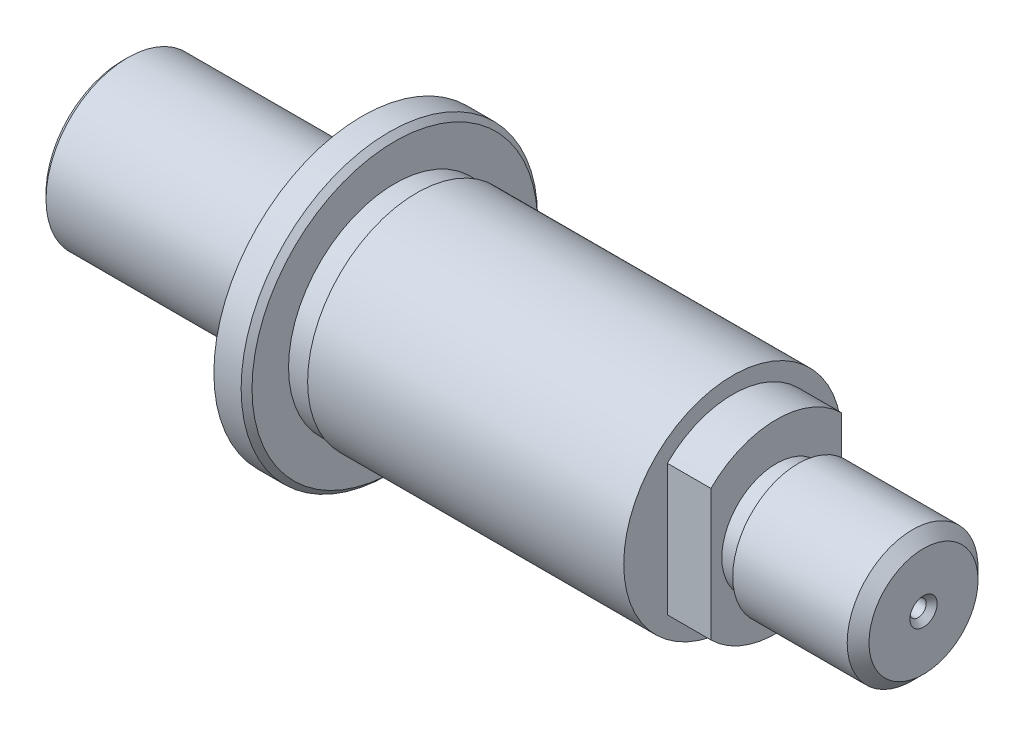
ISO-10303-21;
HEADER;
FILE_DESCRIPTION(('STEP AP214'),'2;1');
FILE_NAME('part.step','',(''),(''),'','','');
FILE_SCHEMA(('AUTOMOTIVE_DESIGN { 1 0 10303 214 1 1 1 1 }'));
ENDSEC;
DATA;
#1=APPLICATION_CONTEXT('core data for automotive mechanical design processes');
#2=APPLICATION_PROTOCOL_DEFINITION('international standard','automotive_design',2000,#1);
#3=PRODUCT_CONTEXT('',#1,'mechanical');
#4=PRODUCT('Part','Part','',(#3));
#5=PRODUCT_RELATED_PRODUCT_CATEGORY('part','',(#4));
#6=PRODUCT_DEFINITION_FORMATION('','',#4);
#7=PRODUCT_DEFINITION_CONTEXT('part definition',#1,'design');
#8=PRODUCT_DEFINITION('design','',#6,#7);
#9=PRODUCT_DEFINITION_SHAPE('','',#8);
#10=(LENGTH_UNIT() NAMED_UNIT(*) SI_UNIT(.MILLI.,.METRE.));
#11=(NAMED_UNIT(*) PLANE_ANGLE_UNIT() SI_UNIT($,.RADIAN.));
#12=(NAMED_UNIT(*) SI_UNIT($,.STERADIAN.) SOLID_ANGLE_UNIT());
#13=UNCERTAINTY_MEASURE_WITH_UNIT(LENGTH_MEASURE(1.E-05),#10,'distance_accuracy_value','');
#14=(GEOMETRIC_REPRESENTATION_CONTEXT(3) GLOBAL_UNCERTAINTY_ASSIGNED_CONTEXT((#13)) GLOBAL_UNIT_ASSIGNED_CONTEXT((#10,
#11,#12)) REPRESENTATION_CONTEXT('',''));
#15=CARTESIAN_POINT('',(0.,0.,0.));
#16=DIRECTION('',(0.,0.,1.));
#17=DIRECTION('',(1.,0.,0.));
#18=AXIS2_PLACEMENT_3D('',#15,#16,#17);
#19=CARTESIAN_POINT('',(0.,0.,0.));
#20=DIRECTION('',(-1.,0.,0.));
#21=DIRECTION('',(0.,0.,1.));
#22=AXIS2_PLACEMENT_3D('',#19,#20,#21);
#23=CYLINDRICAL_SURFACE('',#22,8.5);
#24=CARTESIAN_POINT('',(60.,0.,0.));
#25=DIRECTION('',(-1.,0.,0.));
#26=DIRECTION('',(0.,0.,1.));
#27=AXIS2_PLACEMENT_3D('',#24,#25,#26);
#28=CIRCLE('',#27,8.5);
#29=CARTESIAN_POINT('',(60.,6.02079728939615,6.));
#30=VERTEX_POINT('',#29);
#31=CARTESIAN_POINT('',(60.,6.02079728939615,-6.));
#32=VERTEX_POINT('',#31);
#33=EDGE_CURVE('E143',#30,#32,#28,.T.);
#34=ORIENTED_EDGE('',*,*,#33,.T.);
#35=DIRECTION('',(-1.,0.,0.));
#36=VECTOR('',#35,1.);
#37=CARTESIAN_POINT('',(0.,6.02079728939615,-6.));
#38=LINE('',#37,#36);
#39=CARTESIAN_POINT('',(56.,6.02079728939615,-6.));
#40=VERTEX_POINT('',#39);
#41=EDGE_CURVE('E108',#32,#40,#38,.T.);
#42=ORIENTED_EDGE('',*,*,#41,.T.);
#43=CARTESIAN_POINT('',(56.,0.,0.));
#44=DIRECTION('',(-1.,0.,0.));
#45=DIRECTION('',(0.,0.,1.));
#46=AXIS2_PLACEMENT_3D('',#43,#44,#45);
#47=CIRCLE('',#46,8.5);
#48=CARTESIAN_POINT('',(56.,6.02079728939615,6.));
#49=VERTEX_POINT('',#48);
#50=EDGE_CURVE('E139',#49,#40,#47,.T.);
#51=ORIENTED_EDGE('',*,*,#50,.F.);
#52=DIRECTION('',(-1.,0.,0.));
#53=VECTOR('',#52,1.);
#54=CARTESIAN_POINT('',(0.,6.02079728939615,6.));
#55=LINE('',#54,#53);
#56=EDGE_CURVE('E115',#49,#30,#55,.F.);
#57=ORIENTED_EDGE('',*,*,#56,.T.);
#58=EDGE_LOOP('',(#34,#42,#51,#57));
#59=FACE_BOUND('',#58,.T.);
#60=ADVANCED_FACE('F41',(#59),#23,.T.);
#61=CARTESIAN_POINT('',(73.5,6.,0.));
#62=DIRECTION('',(-1.,0.,0.));
#63=DIRECTION('',(0.,0.,1.));
#64=AXIS2_PLACEMENT_3D('',#61,#62,#63);
#65=PLANE('',#64);
#66=CARTESIAN_POINT('',(73.5,0.,0.));
#67=DIRECTION('',(-1.,0.,0.));
#68=DIRECTION('',(0.,0.,1.));
#69=AXIS2_PLACEMENT_3D('',#66,#67,#68);
#70=CIRCLE('',#69,1.25000000000002);
#71=CARTESIAN_POINT('',(73.5,0.,1.25000000000002));
#72=VERTEX_POINT('',#71);
#73=EDGE_CURVE('E170',#72,#72,#70,.T.);
#74=ORIENTED_EDGE('',*,*,#73,.T.);
#75=EDGE_LOOP('',(#74));
#76=FACE_BOUND('',#75,.T.);
#77=CARTESIAN_POINT('',(73.5,0.,0.));
#78=DIRECTION('',(-1.,0.,0.));
#79=DIRECTION('',(0.,0.,1.));
#80=AXIS2_PLACEMENT_3D('',#77,#78,#79);
#81=CIRCLE('',#80,5.);
#82=CARTESIAN_POINT('',(73.5,0.,5.));
#83=VERTEX_POINT('',#82);
#84=EDGE_CURVE('E164',#83,#83,#81,.F.);
#85=ORIENTED_EDGE('',*,*,#84,.T.);
#86=EDGE_LOOP('',(#85));
#87=FACE_BOUND('',#86,.T.);
#88=ADVANCED_FACE('F193',(#76,#87),#65,.F.);
#89=CARTESIAN_POINT('',(0.,0.,0.));
#90=DIRECTION('',(-1.,0.,0.));
#91=DIRECTION('',(0.,0.,1.));
#92=AXIS2_PLACEMENT_3D('',#89,#90,#91);
#93=CYLINDRICAL_SURFACE('',#92,6.);
#94=CARTESIAN_POINT('',(72.5,0.,0.));
#95=DIRECTION('',(-1.,0.,0.));
#96=DIRECTION('',(0.,0.,1.));
#97=AXIS2_PLACEMENT_3D('',#94,#95,#96);
#98=CIRCLE('',#97,6.);
#99=CARTESIAN_POINT('',(72.5,0.,6.));
#100=VERTEX_POINT('',#99);
#101=EDGE_CURVE('E161',#100,#100,#98,.T.);
#102=ORIENTED_EDGE('',*,*,#101,.T.);
#103=EDGE_LOOP('',(#102));
#104=FACE_BOUND('',#103,.T.);
#105=CARTESIAN_POINT('',(62.,0.,0.));
#106=DIRECTION('',(-1.,0.,0.));
#107=DIRECTION('',(0.,0.,1.));
#108=AXIS2_PLACEMENT_3D('',#105,#106,#107);
#109=CIRCLE('',#108,6.);
#110=CARTESIAN_POINT('',(62.,0.,6.));
#111=VERTEX_POINT('',#110);
#112=EDGE_CURVE('E152',#111,#111,#109,.T.);
#113=ORIENTED_EDGE('',*,*,#112,.F.);
#114=EDGE_LOOP('',(#113));
#115=FACE_BOUND('',#114,.T.);
#116=ADVANCED_FACE('F200',(#104,#115),#93,.T.);
#117=CARTESIAN_POINT('',(62.,5.,0.));
#118=DIRECTION('',(1.,0.,0.));
#119=DIRECTION('',(0.,0.,-1.));
#120=AXIS2_PLACEMENT_3D('',#117,#118,#119);
#121=PLANE('',#120);
#122=CARTESIAN_POINT('',(62.,0.,0.));
#123=DIRECTION('',(-1.,0.,0.));
#124=DIRECTION('',(0.,0.,1.));
#125=AXIS2_PLACEMENT_3D('',#122,#123,#124);
#126=CIRCLE('',#125,5.);
#127=CARTESIAN_POINT('',(62.,0.,5.));
#128=VERTEX_POINT('',#127);
#129=EDGE_CURVE('E149',#128,#128,#126,.T.);
#130=ORIENTED_EDGE('',*,*,#129,.F.);
#131=EDGE_LOOP('',(#130));
#132=FACE_BOUND('',#131,.T.);
#133=ORIENTED_EDGE('',*,*,#112,.T.);
#134=EDGE_LOOP('',(#133));
#135=FACE_BOUND('',#134,.T.);
#136=ADVANCED_FACE('F229',(#132,#135),#121,.F.);
#137=CARTESIAN_POINT('',(0.,0.,0.));
#138=DIRECTION('',(-1.,0.,0.));
#139=DIRECTION('',(0.,0.,1.));
#140=AXIS2_PLACEMENT_3D('',#137,#138,#139);
#141=CYLINDRICAL_SURFACE('',#140,5.);
#142=CARTESIAN_POINT('',(60.,0.,0.));
#143=DIRECTION('',(-1.,0.,0.));
#144=DIRECTION('',(0.,0.,1.));
#145=AXIS2_PLACEMENT_3D('',#142,#143,#144);
#146=CIRCLE('',#145,5.);
#147=CARTESIAN_POINT('',(60.,0.,5.));
#148=VERTEX_POINT('',#147);
#149=EDGE_CURVE('E146',#148,#148,#146,.T.);
#150=ORIENTED_EDGE('',*,*,#149,.F.);
#151=EDGE_LOOP('',(#150));
#152=FACE_BOUND('',#151,.T.);
#153=ORIENTED_EDGE('',*,*,#129,.T.);
#154=EDGE_LOOP('',(#153));
#155=FACE_BOUND('',#154,.T.);
#156=ADVANCED_FACE('F215',(#152,#155),#141,.T.);
#157=CARTESIAN_POINT('',(60.,8.5,0.));
#158=DIRECTION('',(-1.,0.,0.));
#159=DIRECTION('',(0.,0.,1.));
#160=AXIS2_PLACEMENT_3D('',#157,#158,#159);
#161=PLANE('',#160);
#162=CARTESIAN_POINT('',(60.,-6.02079728939615,-6.));
#163=VERTEX_POINT('',#162);
#164=CARTESIAN_POINT('',(60.,-6.02079728939615,6.));
#165=VERTEX_POINT('',#164);
#166=EDGE_CURVE('E142',#163,#165,#28,.T.);
#167=ORIENTED_EDGE('',*,*,#166,.F.);
#168=DIRECTION('',(0.,-1.,0.));
#169=VECTOR('',#168,1.);
#170=CARTESIAN_POINT('',(60.,12.5735252651459,-6.));
#171=LINE('',#170,#169);
#172=EDGE_CURVE('E56',#32,#163,#171,.T.);
#173=ORIENTED_EDGE('',*,*,#172,.F.);
#174=ORIENTED_EDGE('',*,*,#33,.F.);
#175=DIRECTION('',(0.,1.,0.));
#176=VECTOR('',#175,1.);
#177=CARTESIAN_POINT('',(60.,12.5735252651459,6.));
#178=LINE('',#177,#176);
#179=EDGE_CURVE('E64',#165,#30,#178,.T.);
#180=ORIENTED_EDGE('',*,*,#179,.F.);
#181=EDGE_LOOP('',(#167,#173,#174,#180));
#182=FACE_BOUND('',#181,.T.);
#183=ORIENTED_EDGE('',*,*,#149,.T.);
#184=EDGE_LOOP('',(#183));
#185=FACE_BOUND('',#184,.T.);
#186=ADVANCED_FACE('F207',(#182,#185),#161,.F.);
#187=CARTESIAN_POINT('',(56.,-6.02079728939615,-6.));
#188=VERTEX_POINT('',#187);
#189=CARTESIAN_POINT('',(56.,-6.02079728939615,6.));
#190=VERTEX_POINT('',#189);
#191=EDGE_CURVE('E138',#188,#190,#47,.T.);
#192=ORIENTED_EDGE('',*,*,#191,.F.);
#193=DIRECTION('',(-1.,0.,0.));
#194=VECTOR('',#193,1.);
#195=CARTESIAN_POINT('',(0.,-6.02079728939615,-6.));
#196=LINE('',#195,#194);
#197=EDGE_CURVE('E106',#188,#163,#196,.F.);
#198=ORIENTED_EDGE('',*,*,#197,.T.);
#199=ORIENTED_EDGE('',*,*,#166,.T.);
#200=DIRECTION('',(-1.,0.,0.));
#201=VECTOR('',#200,1.);
#202=CARTESIAN_POINT('',(0.,-6.02079728939615,6.));
#203=LINE('',#202,#201);
#204=EDGE_CURVE('E117',#165,#190,#203,.T.);
#205=ORIENTED_EDGE('',*,*,#204,.T.);
#206=EDGE_LOOP('',(#192,#198,#199,#205));
#207=FACE_BOUND('',#206,.T.);
#208=ADVANCED_FACE('F196',(#207),#23,.T.);
#209=CARTESIAN_POINT('',(56.,10.,0.));
#210=DIRECTION('',(-1.,0.,0.));
#211=DIRECTION('',(0.,0.,1.));
#212=AXIS2_PLACEMENT_3D('',#209,#210,#211);
#213=PLANE('',#212);
#214=ORIENTED_EDGE('',*,*,#50,.T.);
#215=DIRECTION('',(0.,-1.,0.));
#216=VECTOR('',#215,1.);
#217=CARTESIAN_POINT('',(56.,12.5735252651459,-6.));
#218=LINE('',#217,#216);
#219=EDGE_CURVE('E103',#40,#188,#218,.T.);
#220=ORIENTED_EDGE('',*,*,#219,.T.);
#221=ORIENTED_EDGE('',*,*,#191,.T.);
#222=DIRECTION('',(0.,1.,0.));
#223=VECTOR('',#222,1.);
#224=CARTESIAN_POINT('',(56.,12.5735252651459,6.));
#225=LINE('',#224,#223);
#226=EDGE_CURVE('E112',#190,#49,#225,.T.);
#227=ORIENTED_EDGE('',*,*,#226,.T.);
#228=EDGE_LOOP('',(#214,#220,#221,#227));
#229=FACE_BOUND('',#228,.T.);
#230=CARTESIAN_POINT('',(56.,0.,0.));
#231=DIRECTION('',(-1.,0.,0.));
#232=DIRECTION('',(0.,0.,1.));
#233=AXIS2_PLACEMENT_3D('',#230,#231,#232);
#234=CIRCLE('',#233,10.);
#235=CARTESIAN_POINT('',(56.,0.,10.));
#236=VERTEX_POINT('',#235);
#237=EDGE_CURVE('E135',#236,#236,#234,.T.);
#238=ORIENTED_EDGE('',*,*,#237,.F.);
#239=EDGE_LOOP('',(#238));
#240=FACE_BOUND('',#239,.T.);
#241=ADVANCED_FACE('F206',(#229,#240),#213,.F.);
#242=CARTESIAN_POINT('',(0.,0.,0.));
#243=DIRECTION('',(-1.,0.,0.));
#244=DIRECTION('',(0.,0.,1.));
#245=AXIS2_PLACEMENT_3D('',#242,#243,#244);
#246=CYLINDRICAL_SURFACE('',#245,10.);
#247=CARTESIAN_POINT('',(27.,0.,0.));
#248=DIRECTION('',(-1.,0.,0.));
#249=DIRECTION('',(0.,0.,1.));
#250=AXIS2_PLACEMENT_3D('',#247,#248,#249);
#251=CIRCLE('',#250,10.);
#252=CARTESIAN_POINT('',(27.,0.,10.));
#253=VERTEX_POINT('',#252);
#254=EDGE_CURVE('E132',#253,#253,#251,.T.);
#255=ORIENTED_EDGE('',*,*,#254,.F.);
#256=EDGE_LOOP('',(#255));
#257=FACE_BOUND('',#256,.T.);
#258=ORIENTED_EDGE('',*,*,#237,.T.);
#259=EDGE_LOOP('',(#258));
#260=FACE_BOUND('',#259,.T.);
#261=ADVANCED_FACE('F213',(#257,#260),#246,.T.);
#262=CARTESIAN_POINT('',(27.,9.75,0.));
#263=DIRECTION('',(1.,0.,0.));
#264=DIRECTION('',(0.,0.,-1.));
#265=AXIS2_PLACEMENT_3D('',#262,#263,#264);
#266=PLANE('',#265);
#267=CARTESIAN_POINT('',(27.,0.,0.));
#268=DIRECTION('',(-1.,0.,0.));
#269=DIRECTION('',(0.,0.,1.));
#270=AXIS2_PLACEMENT_3D('',#267,#268,#269);
#271=CIRCLE('',#270,9.75);
#272=CARTESIAN_POINT('',(27.,0.,9.75));
#273=VERTEX_POINT('',#272);
#274=EDGE_CURVE('E129',#273,#273,#271,.T.);
#275=ORIENTED_EDGE('',*,*,#274,.F.);
#276=EDGE_LOOP('',(#275));
#277=FACE_BOUND('',#276,.T.);
#278=ORIENTED_EDGE('',*,*,#254,.T.);
#279=EDGE_LOOP('',(#278));
#280=FACE_BOUND('',#279,.T.);
#281=ADVANCED_FACE('F299',(#277,#280),#266,.F.);
#282=CARTESIAN_POINT('',(0.,0.,0.));
#283=DIRECTION('',(-1.,0.,0.));
#284=DIRECTION('',(0.,0.,1.));
#285=AXIS2_PLACEMENT_3D('',#282,#283,#284);
#286=CYLINDRICAL_SURFACE('',#285,9.75);
#287=CARTESIAN_POINT('',(25.,0.,0.));
#288=DIRECTION('',(-1.,0.,0.));
#289=DIRECTION('',(0.,0.,1.));
#290=AXIS2_PLACEMENT_3D('',#287,#288,#289);
#291=CIRCLE('',#290,9.75);
#292=CARTESIAN_POINT('',(25.,0.,9.75));
#293=VERTEX_POINT('',#292);
#294=EDGE_CURVE('E126',#293,#293,#291,.T.);
#295=ORIENTED_EDGE('',*,*,#294,.F.);
#296=EDGE_LOOP('',(#295));
#297=FACE_BOUND('',#296,.T.);
#298=ORIENTED_EDGE('',*,*,#274,.T.);
#299=EDGE_LOOP('',(#298));
#300=FACE_BOUND('',#299,.T.);
#301=ADVANCED_FACE('F295',(#297,#300),#286,.T.);
#302=CARTESIAN_POINT('',(25.,13.6,0.));
#303=DIRECTION('',(-1.,0.,0.));
#304=DIRECTION('',(0.,0.,1.));
#305=AXIS2_PLACEMENT_3D('',#302,#303,#304);
#306=PLANE('',#305);
#307=CARTESIAN_POINT('',(25.,0.,0.));
#308=DIRECTION('',(-1.,0.,0.));
#309=DIRECTION('',(0.,0.,1.));
#310=AXIS2_PLACEMENT_3D('',#307,#308,#309);
#311=CIRCLE('',#310,13.1);
#312=CARTESIAN_POINT('',(25.,0.,13.1));
#313=VERTEX_POINT('',#312);
#314=EDGE_CURVE('E158',#313,#313,#311,.F.);
#315=ORIENTED_EDGE('',*,*,#314,.T.);
#316=EDGE_LOOP('',(#315));
#317=FACE_BOUND('',#316,.T.);
#318=ORIENTED_EDGE('',*,*,#294,.T.);
#319=EDGE_LOOP('',(#318));
#320=FACE_BOUND('',#319,.T.);
#321=ADVANCED_FACE('F291',(#317,#320),#306,.F.);
#322=CARTESIAN_POINT('',(0.,0.,0.));
#323=DIRECTION('',(-1.,0.,0.));
#324=DIRECTION('',(0.,0.,1.));
#325=AXIS2_PLACEMENT_3D('',#322,#323,#324);
#326=CYLINDRICAL_SURFACE('',#325,13.6);
#327=CARTESIAN_POINT('',(24.5,0.,0.));
#328=DIRECTION('',(-1.,0.,0.));
#329=DIRECTION('',(0.,0.,1.));
#330=AXIS2_PLACEMENT_3D('',#327,#328,#329);
#331=CIRCLE('',#330,13.6);
#332=CARTESIAN_POINT('',(24.5,0.,13.6));
#333=VERTEX_POINT('',#332);
#334=EDGE_CURVE('E155',#333,#333,#331,.T.);
#335=ORIENTED_EDGE('',*,*,#334,.T.);
#336=EDGE_LOOP('',(#335));
#337=FACE_BOUND('',#336,.T.);
#338=CARTESIAN_POINT('',(22.,0.,0.));
#339=DIRECTION('',(-1.,0.,0.));
#340=DIRECTION('',(0.,0.,1.));
#341=AXIS2_PLACEMENT_3D('',#338,#339,#340);
#342=CIRCLE('',#341,13.6);
#343=CARTESIAN_POINT('',(22.,0.,13.6));
#344=VERTEX_POINT('',#343);
#345=EDGE_CURVE('E123',#344,#344,#342,.T.);
#346=ORIENTED_EDGE('',*,*,#345,.F.);
#347=EDGE_LOOP('',(#346));
#348=FACE_BOUND('',#347,.T.);
#349=ADVANCED_FACE('F287',(#337,#348),#326,.T.);
#350=CARTESIAN_POINT('',(22.,7.5,0.));
#351=DIRECTION('',(1.,0.,0.));
#352=DIRECTION('',(0.,0.,-1.));
#353=AXIS2_PLACEMENT_3D('',#350,#351,#352);
#354=PLANE('',#353);
#355=CARTESIAN_POINT('',(22.,0.,0.));
#356=DIRECTION('',(-1.,0.,0.));
#357=DIRECTION('',(0.,0.,1.));
#358=AXIS2_PLACEMENT_3D('',#355,#356,#357);
#359=CIRCLE('',#358,7.5);
#360=CARTESIAN_POINT('',(22.,0.,7.5));
#361=VERTEX_POINT('',#360);
#362=EDGE_CURVE('E120',#361,#361,#359,.T.);
#363=ORIENTED_EDGE('',*,*,#362,.F.);
#364=EDGE_LOOP('',(#363));
#365=FACE_BOUND('',#364,.T.);
#366=ORIENTED_EDGE('',*,*,#345,.T.);
#367=EDGE_LOOP('',(#366));
#368=FACE_BOUND('',#367,.T.);
#369=ADVANCED_FACE('F283',(#365,#368),#354,.F.);
#370=CARTESIAN_POINT('',(0.,0.,0.));
#371=DIRECTION('',(-1.,0.,0.));
#372=DIRECTION('',(0.,0.,1.));
#373=AXIS2_PLACEMENT_3D('',#370,#371,#372);
#374=CYLINDRICAL_SURFACE('',#373,7.5);
#375=CARTESIAN_POINT('',(0.499999999999992,0.,0.));
#376=DIRECTION('',(1.,0.,0.));
#377=DIRECTION('',(0.,0.,-1.));
#378=AXIS2_PLACEMENT_3D('',#375,#376,#377);
#379=CIRCLE('',#378,7.5);
#380=CARTESIAN_POINT('',(0.499999999999992,0.,-7.5));
#381=VERTEX_POINT('',#380);
#382=EDGE_CURVE('E12',#381,#381,#379,.T.);
#383=ORIENTED_EDGE('',*,*,#382,.T.);
#384=EDGE_LOOP('',(#383));
#385=FACE_BOUND('',#384,.T.);
#386=ORIENTED_EDGE('',*,*,#362,.T.);
#387=EDGE_LOOP('',(#386));
#388=FACE_BOUND('',#387,.T.);
#389=ADVANCED_FACE('F247',(#385,#388),#374,.T.);
#390=CARTESIAN_POINT('',(24.5,0.,0.));
#391=DIRECTION('',(-1.,0.,0.));
#392=DIRECTION('',(0.,0.,1.));
#393=AXIS2_PLACEMENT_3D('',#390,#391,#392);
#394=CONICAL_SURFACE('',#393,13.6,0.78539816339745);
#395=ORIENTED_EDGE('',*,*,#314,.F.);
#396=EDGE_LOOP('',(#395));
#397=FACE_BOUND('',#396,.T.);
#398=ORIENTED_EDGE('',*,*,#334,.F.);
#399=EDGE_LOOP('',(#398));
#400=FACE_BOUND('',#399,.T.);
#401=ADVANCED_FACE('F244',(#397,#400),#394,.T.);
#402=CARTESIAN_POINT('',(29.631709576673,12.5735252651459,6.));
#403=DIRECTION('',(0.,0.,-1.));
#404=DIRECTION('',(-1.,0.,0.));
#405=AXIS2_PLACEMENT_3D('',#402,#403,#404);
#406=PLANE('',#405);
#407=ORIENTED_EDGE('',*,*,#179,.T.);
#408=ORIENTED_EDGE('',*,*,#56,.F.);
#409=ORIENTED_EDGE('',*,*,#226,.F.);
#410=ORIENTED_EDGE('',*,*,#204,.F.);
#411=EDGE_LOOP('',(#407,#408,#409,#410));
#412=FACE_BOUND('',#411,.T.);
#413=ADVANCED_FACE('F222',(#412),#406,.F.);
#414=CARTESIAN_POINT('',(29.631709576673,12.5735252651459,-6.));
#415=DIRECTION('',(0.,0.,1.));
#416=DIRECTION('',(1.,0.,0.));
#417=AXIS2_PLACEMENT_3D('',#414,#415,#416);
#418=PLANE('',#417);
#419=ORIENTED_EDGE('',*,*,#172,.T.);
#420=ORIENTED_EDGE('',*,*,#197,.F.);
#421=ORIENTED_EDGE('',*,*,#219,.F.);
#422=ORIENTED_EDGE('',*,*,#41,.F.);
#423=EDGE_LOOP('',(#419,#420,#421,#422));
#424=FACE_BOUND('',#423,.T.);
#425=ADVANCED_FACE('F253',(#424),#418,.F.);
#426=CARTESIAN_POINT('',(72.5,0.,0.));
#427=DIRECTION('',(-1.,0.,0.));
#428=DIRECTION('',(0.,0.,1.));
#429=AXIS2_PLACEMENT_3D('',#426,#427,#428);
#430=CONICAL_SURFACE('',#429,6.,0.785398163397445);
#431=ORIENTED_EDGE('',*,*,#84,.F.);
#432=EDGE_LOOP('',(#431));
#433=FACE_BOUND('',#432,.T.);
#434=ORIENTED_EDGE('',*,*,#101,.F.);
#435=EDGE_LOOP('',(#434));
#436=FACE_BOUND('',#435,.T.);
#437=ADVANCED_FACE('F249',(#433,#436),#430,.T.);
#438=CARTESIAN_POINT('',(73.5,0.,0.));
#439=DIRECTION('',(1.,0.,0.));
#440=DIRECTION('',(0.,0.,-1.));
#441=AXIS2_PLACEMENT_3D('',#438,#439,#440);
#442=CYLINDRICAL_SURFACE('',#441,0.749999999999999);
#443=CARTESIAN_POINT('',(73.,0.,0.));
#444=DIRECTION('',(-1.,0.,0.));
#445=DIRECTION('',(0.,0.,1.));
#446=AXIS2_PLACEMENT_3D('',#443,#444,#445);
#447=CIRCLE('',#446,0.749999999999999);
#448=CARTESIAN_POINT('',(73.,0.,0.749999999999999));
#449=VERTEX_POINT('',#448);
#450=EDGE_CURVE('E167',#449,#449,#447,.F.);
#451=ORIENTED_EDGE('',*,*,#450,.T.);
#452=EDGE_LOOP('',(#451));
#453=FACE_BOUND('',#452,.T.);
#454=CARTESIAN_POINT('',(71.5,0.,0.));
#455=DIRECTION('',(1.,0.,0.));
#456=DIRECTION('',(0.,0.,-1.));
#457=AXIS2_PLACEMENT_3D('',#454,#455,#456);
#458=CIRCLE('',#457,0.749999999999998);
#459=CARTESIAN_POINT('',(71.5,0.,-0.749999999999998));
#460=VERTEX_POINT('',#459);
#461=EDGE_CURVE('E97',#460,#460,#458,.T.);
#462=ORIENTED_EDGE('',*,*,#461,.F.);
#463=EDGE_LOOP('',(#462));
#464=FACE_BOUND('',#463,.T.);
#465=ADVANCED_FACE('F252',(#453,#464),#442,.F.);
#466=CARTESIAN_POINT('',(71.5,0.,0.));
#467=DIRECTION('',(1.,0.,0.));
#468=DIRECTION('',(0.,0.,-1.));
#469=AXIS2_PLACEMENT_3D('',#466,#467,#468);
#470=CONICAL_SURFACE('',#469,0.749999999999998,1.02974425867666);
#471=CARTESIAN_POINT('',(71.0493545357293,0.,0.));
#472=VERTEX_POINT('',#471);
#473=VERTEX_LOOP('',#472);
#474=FACE_BOUND('',#473,.T.);
#475=ORIENTED_EDGE('',*,*,#461,.T.);
#476=EDGE_LOOP('',(#475));
#477=FACE_BOUND('',#476,.T.);
#478=ADVANCED_FACE('F256',(#474,#477),#470,.F.);
#479=CARTESIAN_POINT('',(73.,0.,0.));
#480=DIRECTION('',(1.,0.,0.));
#481=DIRECTION('',(0.,0.,-1.));
#482=AXIS2_PLACEMENT_3D('',#479,#480,#481);
#483=CONICAL_SURFACE('',#482,0.749999999999999,0.78539816339745);
#484=ORIENTED_EDGE('',*,*,#73,.F.);
#485=EDGE_LOOP('',(#484));
#486=FACE_BOUND('',#485,.T.);
#487=ORIENTED_EDGE('',*,*,#450,.F.);
#488=EDGE_LOOP('',(#487));
#489=FACE_BOUND('',#488,.T.);
#490=ADVANCED_FACE('F91',(#486,#489),#483,.F.);
#491=CARTESIAN_POINT('',(2.,0.,0.));
#492=DIRECTION('',(-1.,0.,0.));
#493=DIRECTION('',(0.,0.,1.));
#494=AXIS2_PLACEMENT_3D('',#491,#492,#493);
#495=CONICAL_SURFACE('',#494,0.749999999999987,1.02974425867665);
#496=CARTESIAN_POINT('',(2.45064546427066,0.,0.));
#497=VERTEX_POINT('',#496);
#498=VERTEX_LOOP('',#497);
#499=FACE_BOUND('',#498,.T.);
#500=CARTESIAN_POINT('',(2.,0.,0.));
#501=DIRECTION('',(-1.,0.,0.));
#502=DIRECTION('',(0.,0.,1.));
#503=AXIS2_PLACEMENT_3D('',#500,#501,#502);
#504=CIRCLE('',#503,0.749999999999987);
#505=CARTESIAN_POINT('',(2.,0.,0.749999999999987));
#506=VERTEX_POINT('',#505);
#507=EDGE_CURVE('E95',#506,#506,#504,.T.);
#508=ORIENTED_EDGE('',*,*,#507,.T.);
#509=EDGE_LOOP('',(#508));
#510=FACE_BOUND('',#509,.T.);
#511=ADVANCED_FACE('F87',(#499,#510),#495,.F.);
#512=CARTESIAN_POINT('',(0.,0.,0.));
#513=DIRECTION('',(-1.,0.,0.));
#514=DIRECTION('',(0.,0.,1.));
#515=AXIS2_PLACEMENT_3D('',#512,#513,#514);
#516=CYLINDRICAL_SURFACE('',#515,0.749999999999988);
#517=CARTESIAN_POINT('',(0.499999999999995,0.,0.));
#518=DIRECTION('',(1.,0.,0.));
#519=DIRECTION('',(0.,0.,-1.));
#520=AXIS2_PLACEMENT_3D('',#517,#518,#519);
#521=CIRCLE('',#520,0.749999999999988);
#522=CARTESIAN_POINT('',(0.499999999999995,0.,-0.749999999999988));
#523=VERTEX_POINT('',#522);
#524=EDGE_CURVE('E173',#523,#523,#521,.F.);
#525=ORIENTED_EDGE('',*,*,#524,.T.);
#526=EDGE_LOOP('',(#525));
#527=FACE_BOUND('',#526,.T.);
#528=ORIENTED_EDGE('',*,*,#507,.F.);
#529=EDGE_LOOP('',(#528));
#530=FACE_BOUND('',#529,.T.);
#531=ADVANCED_FACE('F90',(#527,#530),#516,.F.);
#532=CARTESIAN_POINT('',(0.499999999999995,0.,0.));
#533=DIRECTION('',(-1.,0.,0.));
#534=DIRECTION('',(0.,0.,1.));
#535=AXIS2_PLACEMENT_3D('',#532,#533,#534);
#536=CONICAL_SURFACE('',#535,0.749999999999988,0.785398163397453);
#537=CARTESIAN_POINT('',(0.,0.,0.));
#538=DIRECTION('',(1.,0.,0.));
#539=DIRECTION('',(0.,0.,-1.));
#540=AXIS2_PLACEMENT_3D('',#537,#538,#539);
#541=CIRCLE('',#540,1.24999999999999);
#542=CARTESIAN_POINT('',(0.,0.,-1.24999999999999));
#543=VERTEX_POINT('',#542);
#544=EDGE_CURVE('E176',#543,#543,#541,.T.);
#545=ORIENTED_EDGE('',*,*,#544,.F.);
#546=EDGE_LOOP('',(#545));
#547=FACE_BOUND('',#546,.T.);
#548=ORIENTED_EDGE('',*,*,#524,.F.);
#549=EDGE_LOOP('',(#548));
#550=FACE_BOUND('',#549,.T.);
#551=ADVANCED_FACE('F189',(#547,#550),#536,.F.);
#552=CARTESIAN_POINT('',(0.,0.,0.));
#553=DIRECTION('',(1.,0.,0.));
#554=DIRECTION('',(0.,0.,-1.));
#555=AXIS2_PLACEMENT_3D('',#552,#553,#554);
#556=PLANE('',#555);
#557=CARTESIAN_POINT('',(0.,0.,0.));
#558=DIRECTION('',(1.,0.,0.));
#559=DIRECTION('',(0.,0.,-1.));
#560=AXIS2_PLACEMENT_3D('',#557,#558,#559);
#561=CIRCLE('',#560,7.);
#562=CARTESIAN_POINT('',(0.,0.,-7.));
#563=VERTEX_POINT('',#562);
#564=EDGE_CURVE('E49',#563,#563,#561,.F.);
#565=ORIENTED_EDGE('',*,*,#564,.T.);
#566=EDGE_LOOP('',(#565));
#567=FACE_BOUND('',#566,.T.);
#568=ORIENTED_EDGE('',*,*,#544,.T.);
#569=EDGE_LOOP('',(#568));
#570=FACE_BOUND('',#569,.T.);
#571=ADVANCED_FACE('F181',(#567,#570),#556,.F.);
#572=CARTESIAN_POINT('',(0.,0.,0.));
#573=DIRECTION('',(1.,0.,0.));
#574=DIRECTION('',(0.,0.,-1.));
#575=AXIS2_PLACEMENT_3D('',#572,#573,#574);
#576=CONICAL_SURFACE('',#575,7.,0.785398163397458);
#577=ORIENTED_EDGE('',*,*,#382,.F.);
#578=EDGE_LOOP('',(#577));
#579=FACE_BOUND('',#578,.T.);
#580=ORIENTED_EDGE('',*,*,#564,.F.);
#581=EDGE_LOOP('',(#580));
#582=FACE_BOUND('',#581,.T.);
#583=ADVANCED_FACE('F43',(#579,#582),#576,.T.);
#584=CLOSED_SHELL('',(#60,#88,#116,#136,#156,#186,#208,#241,#261,#281,#301,#321,#349,#369,#389,
#401,#413,#425,#437,#465,#478,#490,#511,#531,#551,#571,#583));
#585=MANIFOLD_SOLID_BREP('B2',#584);
#586=ADVANCED_BREP_SHAPE_REPRESENTATION('',(#18,#585),#14);
#587=SHAPE_DEFINITION_REPRESENTATION(#9,#586);
ENDSEC;
END-ISO-10303-21;
